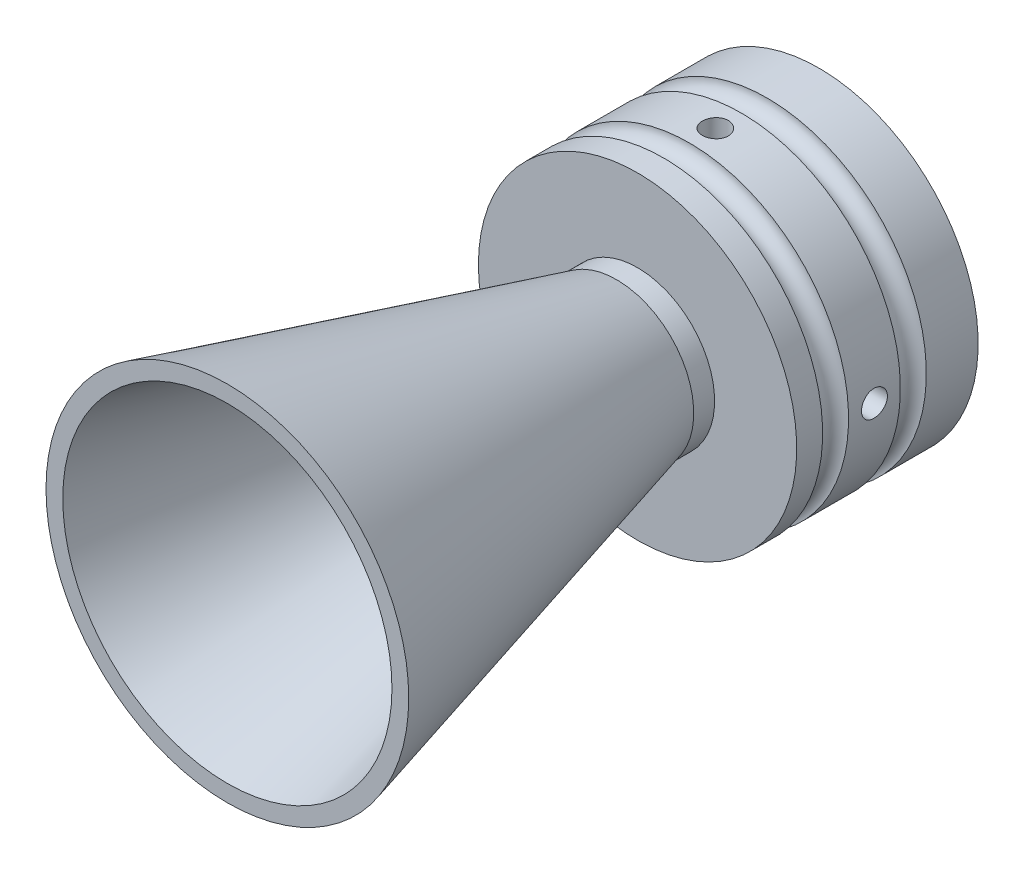
ISO-10303-21;
HEADER;
FILE_DESCRIPTION(('STEP AP214'),'2;1');
FILE_NAME('part.step','',(''),(''),'','','');
FILE_SCHEMA(('AUTOMOTIVE_DESIGN { 1 0 10303 214 1 1 1 1 }'));
ENDSEC;
DATA;
#1=APPLICATION_CONTEXT('core data for automotive mechanical design processes');
#2=APPLICATION_PROTOCOL_DEFINITION('international standard','automotive_design',2000,#1);
#3=PRODUCT_CONTEXT('',#1,'mechanical');
#4=PRODUCT('Part','Part','',(#3));
#5=PRODUCT_RELATED_PRODUCT_CATEGORY('part','',(#4));
#6=PRODUCT_DEFINITION_FORMATION('','',#4);
#7=PRODUCT_DEFINITION_CONTEXT('part definition',#1,'design');
#8=PRODUCT_DEFINITION('design','',#6,#7);
#9=PRODUCT_DEFINITION_SHAPE('','',#8);
#10=(LENGTH_UNIT() NAMED_UNIT(*) SI_UNIT(.MILLI.,.METRE.));
#11=(NAMED_UNIT(*) PLANE_ANGLE_UNIT() SI_UNIT($,.RADIAN.));
#12=(NAMED_UNIT(*) SI_UNIT($,.STERADIAN.) SOLID_ANGLE_UNIT());
#13=UNCERTAINTY_MEASURE_WITH_UNIT(LENGTH_MEASURE(1.E-05),#10,'distance_accuracy_value','');
#14=(GEOMETRIC_REPRESENTATION_CONTEXT(3) GLOBAL_UNCERTAINTY_ASSIGNED_CONTEXT((#13)) GLOBAL_UNIT_ASSIGNED_CONTEXT((#10,
#11,#12)) REPRESENTATION_CONTEXT('',''));
#15=CARTESIAN_POINT('',(0.,0.,0.));
#16=DIRECTION('',(0.,0.,1.));
#17=DIRECTION('',(1.,0.,0.));
#18=AXIS2_PLACEMENT_3D('',#15,#16,#17);
#19=CARTESIAN_POINT('',(0.,0.,-75.3084405577299));
#20=DIRECTION('',(0.,0.,-1.));
#21=DIRECTION('',(-1.,0.,0.));
#22=AXIS2_PLACEMENT_3D('',#19,#20,#21);
#23=CYLINDRICAL_SURFACE('',#22,24.5618);
#24=CARTESIAN_POINT('',(0.,0.,-27.1443538460579));
#25=DIRECTION('',(0.,0.,-1.));
#26=DIRECTION('',(-1.,0.,0.));
#27=AXIS2_PLACEMENT_3D('',#24,#25,#26);
#28=CIRCLE('',#27,24.5618);
#29=CARTESIAN_POINT('',(-24.5618,0.,-27.1443538460579));
#30=VERTEX_POINT('',#29);
#31=EDGE_CURVE('E118',#30,#30,#28,.T.);
#32=ORIENTED_EDGE('',*,*,#31,.F.);
#33=EDGE_LOOP('',(#32));
#34=FACE_BOUND('',#33,.T.);
#35=CARTESIAN_POINT('',(0.,0.,-19.1443538460579));
#36=DIRECTION('',(0.,0.,-1.));
#37=DIRECTION('',(-1.,0.,0.));
#38=AXIS2_PLACEMENT_3D('',#35,#36,#37);
#39=CIRCLE('',#38,24.5618);
#40=CARTESIAN_POINT('',(-24.5618,0.,-19.1443538460579));
#41=VERTEX_POINT('',#40);
#42=EDGE_CURVE('E85',#41,#41,#39,.T.);
#43=ORIENTED_EDGE('',*,*,#42,.T.);
#44=EDGE_LOOP('',(#43));
#45=FACE_BOUND('',#44,.T.);
#46=ADVANCED_FACE('F40',(#34,#45),#23,.T.);
#47=CARTESIAN_POINT('',(0.,0.,-27.1443538460579));
#48=DIRECTION('',(0.,0.,-1.));
#49=DIRECTION('',(-1.,0.,0.));
#50=AXIS2_PLACEMENT_3D('',#47,#48,#49);
#51=CONICAL_SURFACE('',#50,24.5618,0.5235987755983);
#52=CARTESIAN_POINT('',(0.,0.,0.));
#53=DIRECTION('',(0.,0.,-1.));
#54=DIRECTION('',(-1.,0.,0.));
#55=AXIS2_PLACEMENT_3D('',#52,#53,#54);
#56=CIRCLE('',#55,8.89000000000001);
#57=CARTESIAN_POINT('',(-8.89000000000001,0.,0.));
#58=VERTEX_POINT('',#57);
#59=EDGE_CURVE('E115',#58,#58,#56,.T.);
#60=ORIENTED_EDGE('',*,*,#59,.F.);
#61=EDGE_LOOP('',(#60));
#62=FACE_BOUND('',#61,.T.);
#63=ORIENTED_EDGE('',*,*,#31,.T.);
#64=EDGE_LOOP('',(#63));
#65=FACE_BOUND('',#64,.T.);
#66=ADVANCED_FACE('F158',(#62,#65),#51,.F.);
#67=CARTESIAN_POINT('',(0.,0.,-75.3084405577299));
#68=DIRECTION('',(0.,0.,-1.));
#69=DIRECTION('',(-1.,0.,0.));
#70=AXIS2_PLACEMENT_3D('',#67,#68,#69);
#71=CYLINDRICAL_SURFACE('',#70,8.89000000000001);
#72=CARTESIAN_POINT('',(0.,0.,2.54));
#73=DIRECTION('',(0.,0.,-1.));
#74=DIRECTION('',(-1.,0.,0.));
#75=AXIS2_PLACEMENT_3D('',#72,#73,#74);
#76=CIRCLE('',#75,8.89000000000001);
#77=CARTESIAN_POINT('',(-8.89000000000001,0.,2.54));
#78=VERTEX_POINT('',#77);
#79=EDGE_CURVE('E112',#78,#78,#76,.T.);
#80=ORIENTED_EDGE('',*,*,#79,.F.);
#81=EDGE_LOOP('',(#80));
#82=FACE_BOUND('',#81,.T.);
#83=ORIENTED_EDGE('',*,*,#59,.T.);
#84=EDGE_LOOP('',(#83));
#85=FACE_BOUND('',#84,.T.);
#86=ADVANCED_FACE('F163',(#82,#85),#71,.F.);
#87=CARTESIAN_POINT('',(0.,0.,2.54));
#88=DIRECTION('',(0.,0.,1.));
#89=DIRECTION('',(1.,0.,0.));
#90=AXIS2_PLACEMENT_3D('',#87,#88,#89);
#91=CONICAL_SURFACE('',#90,8.89000000000001,0.26179938779915);
#92=CARTESIAN_POINT('',(0.,0.,64.1561588329619));
#93=DIRECTION('',(0.,0.,-1.));
#94=DIRECTION('',(-1.,0.,0.));
#95=AXIS2_PLACEMENT_3D('',#92,#93,#94);
#96=CIRCLE('',#95,25.4);
#97=CARTESIAN_POINT('',(-25.4,0.,64.1561588329619));
#98=VERTEX_POINT('',#97);
#99=EDGE_CURVE('E109',#98,#98,#96,.T.);
#100=ORIENTED_EDGE('',*,*,#99,.F.);
#101=EDGE_LOOP('',(#100));
#102=FACE_BOUND('',#101,.T.);
#103=ORIENTED_EDGE('',*,*,#79,.T.);
#104=EDGE_LOOP('',(#103));
#105=FACE_BOUND('',#104,.T.);
#106=ADVANCED_FACE('F171',(#102,#105),#91,.F.);
#107=CARTESIAN_POINT('',(25.4,0.,64.156158832962));
#108=DIRECTION('',(0.,0.,-1.));
#109=DIRECTION('',(-1.,0.,0.));
#110=AXIS2_PLACEMENT_3D('',#107,#108,#109);
#111=PLANE('',#110);
#112=CARTESIAN_POINT('',(0.,0.,64.1561588329619));
#113=DIRECTION('',(0.,0.,-1.));
#114=DIRECTION('',(-1.,0.,0.));
#115=AXIS2_PLACEMENT_3D('',#112,#113,#114);
#116=CIRCLE('',#115,27.9881904510252);
#117=CARTESIAN_POINT('',(-27.9881904510252,0.,64.1561588329619));
#118=VERTEX_POINT('',#117);
#119=EDGE_CURVE('E106',#118,#118,#116,.T.);
#120=ORIENTED_EDGE('',*,*,#119,.F.);
#121=EDGE_LOOP('',(#120));
#122=FACE_BOUND('',#121,.T.);
#123=ORIENTED_EDGE('',*,*,#99,.T.);
#124=EDGE_LOOP('',(#123));
#125=FACE_BOUND('',#124,.T.);
#126=ADVANCED_FACE('F178',(#122,#125),#111,.F.);
#127=CARTESIAN_POINT('',(0.,0.,64.1561588329619));
#128=DIRECTION('',(0.,0.,1.));
#129=DIRECTION('',(1.,0.,0.));
#130=AXIS2_PLACEMENT_3D('',#127,#128,#129);
#131=CONICAL_SURFACE('',#130,27.9881904510252,0.261799387799151);
#132=CARTESIAN_POINT('',(0.,0.,4.07689415981595));
#133=DIRECTION('',(0.,0.,-1.));
#134=DIRECTION('',(-1.,0.,0.));
#135=AXIS2_PLACEMENT_3D('',#132,#133,#134);
#136=CIRCLE('',#135,11.89);
#137=CARTESIAN_POINT('',(-11.89,0.,4.07689415981595));
#138=VERTEX_POINT('',#137);
#139=EDGE_CURVE('E103',#138,#138,#136,.T.);
#140=ORIENTED_EDGE('',*,*,#139,.F.);
#141=EDGE_LOOP('',(#140));
#142=FACE_BOUND('',#141,.T.);
#143=ORIENTED_EDGE('',*,*,#119,.T.);
#144=EDGE_LOOP('',(#143));
#145=FACE_BOUND('',#144,.T.);
#146=ADVANCED_FACE('F182',(#142,#145),#131,.T.);
#147=CARTESIAN_POINT('',(0.,0.,-75.3084405577299));
#148=DIRECTION('',(0.,0.,-1.));
#149=DIRECTION('',(-1.,0.,0.));
#150=AXIS2_PLACEMENT_3D('',#147,#148,#149);
#151=CYLINDRICAL_SURFACE('',#150,11.89);
#152=CARTESIAN_POINT('',(0.,0.,0.855646153942138));
#153=DIRECTION('',(0.,0.,-1.));
#154=DIRECTION('',(-1.,0.,0.));
#155=AXIS2_PLACEMENT_3D('',#152,#153,#154);
#156=CIRCLE('',#155,11.89);
#157=CARTESIAN_POINT('',(-11.89,0.,0.855646153942138));
#158=VERTEX_POINT('',#157);
#159=EDGE_CURVE('E100',#158,#158,#156,.T.);
#160=ORIENTED_EDGE('',*,*,#159,.F.);
#161=EDGE_LOOP('',(#160));
#162=FACE_BOUND('',#161,.T.);
#163=ORIENTED_EDGE('',*,*,#139,.T.);
#164=EDGE_LOOP('',(#163));
#165=FACE_BOUND('',#164,.T.);
#166=ADVANCED_FACE('F186',(#162,#165),#151,.T.);
#167=CARTESIAN_POINT('',(11.89,0.,0.855646153942135));
#168=DIRECTION('',(0.,0.,-1.));
#169=DIRECTION('',(-1.,0.,0.));
#170=AXIS2_PLACEMENT_3D('',#167,#168,#169);
#171=PLANE('',#170);
#172=CARTESIAN_POINT('',(0.,0.,0.855646153942138));
#173=DIRECTION('',(0.,0.,-1.));
#174=DIRECTION('',(-1.,0.,0.));
#175=AXIS2_PLACEMENT_3D('',#172,#173,#174);
#176=CIRCLE('',#175,24.5618);
#177=CARTESIAN_POINT('',(-24.5618,0.,0.855646153942138));
#178=VERTEX_POINT('',#177);
#179=EDGE_CURVE('E97',#178,#178,#176,.T.);
#180=ORIENTED_EDGE('',*,*,#179,.F.);
#181=EDGE_LOOP('',(#180));
#182=FACE_BOUND('',#181,.T.);
#183=ORIENTED_EDGE('',*,*,#159,.T.);
#184=EDGE_LOOP('',(#183));
#185=FACE_BOUND('',#184,.T.);
#186=ADVANCED_FACE('F190',(#182,#185),#171,.F.);
#187=CARTESIAN_POINT('',(0.,0.,-75.3084405577299));
#188=DIRECTION('',(0.,0.,-1.));
#189=DIRECTION('',(-1.,0.,0.));
#190=AXIS2_PLACEMENT_3D('',#187,#188,#189);
#191=CYLINDRICAL_SURFACE('',#190,24.5618);
#192=CARTESIAN_POINT('',(0.,0.,-3.14435384605787));
#193=DIRECTION('',(0.,0.,-1.));
#194=DIRECTION('',(-1.,0.,0.));
#195=AXIS2_PLACEMENT_3D('',#192,#193,#194);
#196=CIRCLE('',#195,24.5618);
#197=CARTESIAN_POINT('',(-24.5618,0.,-3.14435384605787));
#198=VERTEX_POINT('',#197);
#199=EDGE_CURVE('E94',#198,#198,#196,.T.);
#200=ORIENTED_EDGE('',*,*,#199,.F.);
#201=EDGE_LOOP('',(#200));
#202=FACE_BOUND('',#201,.T.);
#203=ORIENTED_EDGE('',*,*,#179,.T.);
#204=EDGE_LOOP('',(#203));
#205=FACE_BOUND('',#204,.T.);
#206=ADVANCED_FACE('F194',(#202,#205),#191,.T.);
#207=CARTESIAN_POINT('',(0.,0.,-5.14435384605787));
#208=DIRECTION('',(0.,0.,-1.));
#209=DIRECTION('',(-1.,0.,0.));
#210=AXIS2_PLACEMENT_3D('',#207,#208,#209);
#211=TOROIDAL_SURFACE('',#210,24.5618,2.);
#212=CARTESIAN_POINT('',(0.,0.,-7.14435384605787));
#213=DIRECTION('',(0.,0.,-1.));
#214=DIRECTION('',(-1.,0.,0.));
#215=AXIS2_PLACEMENT_3D('',#212,#213,#214);
#216=CIRCLE('',#215,24.5618);
#217=CARTESIAN_POINT('',(-24.5618,0.,-7.14435384605787));
#218=VERTEX_POINT('',#217);
#219=EDGE_CURVE('E91',#218,#218,#216,.T.);
#220=ORIENTED_EDGE('',*,*,#219,.F.);
#221=EDGE_LOOP('',(#220));
#222=FACE_BOUND('',#221,.T.);
#223=ORIENTED_EDGE('',*,*,#199,.T.);
#224=EDGE_LOOP('',(#223));
#225=FACE_BOUND('',#224,.T.);
#226=ADVANCED_FACE('F153',(#222,#225),#211,.F.);
#227=CARTESIAN_POINT('',(0.,0.,-75.3084405577299));
#228=DIRECTION('',(0.,0.,-1.));
#229=DIRECTION('',(-1.,0.,0.));
#230=AXIS2_PLACEMENT_3D('',#227,#228,#229);
#231=CYLINDRICAL_SURFACE('',#230,24.5618);
#232=CARTESIAN_POINT('',(0.,24.5618,-9.14435384605787));
#233=CARTESIAN_POINT('',(-0.112141593484284,24.5617989315381,-9.14435874811144));
#234=CARTESIAN_POINT('',(-0.224359753682799,24.5610238041837,-9.15381737125759));
#235=CARTESIAN_POINT('',(-0.445691870877797,24.5580061929669,-9.19141078284147));
#236=CARTESIAN_POINT('',(-0.554802154040363,24.5557620420353,-9.21956678986824));
#237=CARTESIAN_POINT('',(-0.76668086212744,24.5500600119672,-9.29373593751335));
#238=CARTESIAN_POINT('',(-0.869452812845445,24.5466028148983,-9.33973904465828));
#239=CARTESIAN_POINT('',(-1.06579142249106,24.5388625155217,-9.44827875128519));
#240=CARTESIAN_POINT('',(-1.15936005884735,24.5345795912182,-9.51081178844397));
#241=CARTESIAN_POINT('',(-1.33488912846614,24.5256568334725,-9.65080123813603));
#242=CARTESIAN_POINT('',(-1.4168240164639,24.5210162481033,-9.72828963608943));
#243=CARTESIAN_POINT('',(-1.56654063553194,24.5119075106196,-9.89592272796304));
#244=CARTESIAN_POINT('',(-1.63432174808216,24.5074393660477,-9.98606797469985));
#245=CARTESIAN_POINT('',(-1.75389264893964,24.4991732510783,-10.1766097968936));
#246=CARTESIAN_POINT('',(-1.80566007898563,24.4953762208288,-10.2770204471328));
#247=CARTESIAN_POINT('',(-1.89159128999419,24.4888907359153,-10.4851446433521));
#248=CARTESIAN_POINT('',(-1.92575536924911,24.4862022624667,-10.5928580655504));
#249=CARTESIAN_POINT('',(-1.97543622928937,24.4822445277374,-10.8122749693194));
#250=CARTESIAN_POINT('',(-1.99099451343345,24.4809721081522,-10.9239689957066));
#251=CARTESIAN_POINT('',(-2.00315034735945,24.4799805359079,-11.1483898322658));
#252=CARTESIAN_POINT('',(-1.99974823837185,24.4802613552951,-11.2611166238147));
#253=CARTESIAN_POINT('',(-1.97411417310895,24.4823416649176,-11.4841188385109));
#254=CARTESIAN_POINT('',(-1.95192730226052,24.4841375188718,-11.5943994828793));
#255=CARTESIAN_POINT('',(-1.88942355030596,24.489039839819,-11.8096662806615));
#256=CARTESIAN_POINT('',(-1.84910649915756,24.4921463191043,-11.9146523844076));
#257=CARTESIAN_POINT('',(-1.75143628711684,24.4993240464494,-12.116493732019));
#258=CARTESIAN_POINT('',(-1.69406287524686,24.5033964401687,-12.2133391341247));
#259=CARTESIAN_POINT('',(-1.56392316815058,24.5120460643315,-12.3960423698499));
#260=CARTESIAN_POINT('',(-1.49115657548718,24.5166233045293,-12.4818999911048));
#261=CARTESIAN_POINT('',(-1.33204310256705,24.5257830444986,-12.6404526475324));
#262=CARTESIAN_POINT('',(-1.24565724111137,24.5303655206868,-12.7131085707402));
#263=CARTESIAN_POINT('',(-1.06189347076513,24.5390066648017,-12.8428930647051));
#264=CARTESIAN_POINT('',(-0.964515554959157,24.5430653323989,-12.9000216256934));
#265=CARTESIAN_POINT('',(-0.761506630046312,24.5502022750295,-12.9971272003369));
#266=CARTESIAN_POINT('',(-0.655874801100777,24.5532804525189,-13.0371025076398));
#267=CARTESIAN_POINT('',(-0.439368106974056,24.5581084499974,-13.0987395689671));
#268=CARTESIAN_POINT('',(-0.328493345726816,24.5598582963071,-13.1204016858648));
#269=CARTESIAN_POINT('',(-0.104987164495275,24.5618290904761,-13.1447484803297));
#270=CARTESIAN_POINT('',(0.00763833330109771,24.5620543911013,-13.1474871870383));
#271=CARTESIAN_POINT('',(0.231746894714884,24.5609623288912,-13.1340509187828));
#272=CARTESIAN_POINT('',(0.343229968490891,24.5596449797854,-13.1178761121477));
#273=CARTESIAN_POINT('',(0.561735222455953,24.5556185842572,-13.0671167370458));
#274=CARTESIAN_POINT('',(0.668763251956354,24.5529114291862,-13.0325571855992));
#275=CARTESIAN_POINT('',(0.875501407121716,24.5464095806382,-12.9460348763494));
#276=CARTESIAN_POINT('',(0.975211422133711,24.5426148707209,-12.8940718554608));
#277=CARTESIAN_POINT('',(1.16472918322411,24.5343525505745,-12.774081689002));
#278=CARTESIAN_POINT('',(1.25451418216037,24.5298834479219,-12.7060187199422));
#279=CARTESIAN_POINT('',(1.4214036910347,24.5207795496767,-12.5558125040719));
#280=CARTESIAN_POINT('',(1.49850799057751,24.5161447513364,-12.4736690236869));
#281=CARTESIAN_POINT('',(1.63803248389374,24.507218973617,-12.2973992226019));
#282=CARTESIAN_POINT('',(1.70041744147482,24.502928835165,-12.2032449625951));
#283=CARTESIAN_POINT('',(1.80849082929525,24.4951899013911,-12.005765504431));
#284=CARTESIAN_POINT('',(1.85417941976015,24.4917410979954,-11.902440394293));
#285=CARTESIAN_POINT('',(1.92750301656592,24.4860799528597,-11.6896774288129));
#286=CARTESIAN_POINT('',(1.9551596554701,24.4838661300012,-11.5802470696249));
#287=CARTESIAN_POINT('',(1.99170473323817,24.4809205894277,-11.3582771328733));
#288=CARTESIAN_POINT('',(2.00059351439776,24.480188844682,-11.2457376120537));
#289=CARTESIAN_POINT('',(1.9993466786577,24.480290681317,-11.0210941229522));
#290=CARTESIAN_POINT('',(1.98926642817877,24.4811197071557,-10.9089898411436));
#291=CARTESIAN_POINT('',(1.95048305264641,24.4842399975029,-10.6880719673451));
#292=CARTESIAN_POINT('',(1.92177989854078,24.4865312642925,-10.579258380489));
#293=CARTESIAN_POINT('',(1.84657937422165,24.4923166738984,-10.368006658593));
#294=CARTESIAN_POINT('',(1.80008293099049,24.4958107540505,-10.2655681917497));
#295=CARTESIAN_POINT('',(1.69062199128293,24.5036081825676,-10.0699423404221));
#296=CARTESIAN_POINT('',(1.62765777053335,24.5079115173826,-9.97675480108181));
#297=CARTESIAN_POINT('',(1.48684069912956,24.5168574897544,-9.80199285502212));
#298=CARTESIAN_POINT('',(1.40894691182899,24.5215010380279,-9.72045148042843));
#299=CARTESIAN_POINT('',(1.24055490572318,24.5305959311298,-9.57156801992899));
#300=CARTESIAN_POINT('',(1.15005363825368,24.5350472291275,-9.50422937837309));
#301=CARTESIAN_POINT('',(0.958848784812307,24.5432637395329,-9.38557692814964));
#302=CARTESIAN_POINT('',(0.858127172153494,24.5470277057108,-9.33429210946005));
#303=CARTESIAN_POINT('',(0.649541116056348,24.55343067707,-9.24942754205893));
#304=CARTESIAN_POINT('',(0.541685061367675,24.5560709772283,-9.2158274018796));
#305=CARTESIAN_POINT('',(0.360991871524487,24.5592498609918,-9.17586145108481));
#306=CARTESIAN_POINT('',(0.289317448558754,24.5602018203546,-9.16406175927214));
#307=CARTESIAN_POINT('',(0.145106036745532,24.5614772347798,-9.14830638051456));
#308=CARTESIAN_POINT('',(0.0725690500678837,24.5618006914229,-9.14435067384174));
#309=CARTESIAN_POINT('',(0.,24.5618,-9.14435384605787));
#310=B_SPLINE_CURVE_WITH_KNOTS('',3,(#232,#233,#234,#235,#236,#237,#238,#239,#240,#241,#242,
#243,#244,#245,#246,#247,#248,#249,#250,#251,#252,#253,#254,#255,#256,#257,#258,#259,#260,#261,
#262,#263,#264,#265,#266,#267,#268,#269,#270,#271,#272,#273,#274,#275,#276,#277,#278,#279,#280,
#281,#282,#283,#284,#285,#286,#287,#288,#289,#290,#291,#292,#293,#294,#295,#296,#297,#298,#299,
#300,#301,#302,#303,#304,#305,#306,#307,#308,#309),.UNSPECIFIED.,.T.,.F.,(4,2,2,2,2,2,2,2,2,2,2,
2,2,2,2,2,2,2,2,2,2,2,2,2,2,2,2,2,2,2,2,2,2,2,2,2,2,2,4),(0.,0.336159827874987,
0.672701797698236,1.0090548402966,1.34533545531821,1.68234341603319,2.01936610091733,
2.35685723401653,2.69434264807169,3.03107383142367,3.36779895463901,3.70371818528233,
4.03964056656492,4.37596339151666,4.71229271571157,5.04960277158238,5.38691303966608,
5.72425685455181,6.06159398486005,6.39796756819628,6.73433815785193,7.07025219804378,
7.40617131642046,7.74284502783746,8.07952432470397,8.41700159120252,8.75447561903851,
9.09154403758109,9.42860630848187,9.76468629459759,10.1007668050078,10.4368298089137,
10.7728871863381,11.1098795630184,11.4469535710586,11.7846328017556,12.1219218108085,
12.3394580520542,12.556993746188),.UNSPECIFIED.);
#311=CARTESIAN_POINT('',(0.,24.5618,-9.14435384605787));
#312=VERTEX_POINT('',#311);
#313=EDGE_CURVE('E11',#312,#312,#310,.T.);
#314=ORIENTED_EDGE('',*,*,#313,.T.);
#315=EDGE_LOOP('',(#314));
#316=FACE_BOUND('',#315,.T.);
#317=CARTESIAN_POINT('',(24.5618,0.,-13.1443538460579));
#318=CARTESIAN_POINT('',(24.5617989315381,-0.112141593484284,-13.1443489440043));
#319=CARTESIAN_POINT('',(24.5610238041837,-0.224359753682799,-13.1348903208581));
#320=CARTESIAN_POINT('',(24.5580061929669,-0.445691870877796,-13.0972969092742));
#321=CARTESIAN_POINT('',(24.5557620420353,-0.554802154040362,-13.0691409022475));
#322=CARTESIAN_POINT('',(24.5500600119672,-0.766680862127437,-12.9949717546024));
#323=CARTESIAN_POINT('',(24.5466028148983,-0.869452812845441,-12.9489686474574));
#324=CARTESIAN_POINT('',(24.5388625155217,-1.06579142249106,-12.8404289408305));
#325=CARTESIAN_POINT('',(24.5345795912182,-1.15936005884734,-12.7778959036717));
#326=CARTESIAN_POINT('',(24.5256568334725,-1.33488912846613,-12.6379064539797));
#327=CARTESIAN_POINT('',(24.5210162481033,-1.41682401646388,-12.5604180560263));
#328=CARTESIAN_POINT('',(24.5119075106196,-1.56654063553193,-12.3927849641526));
#329=CARTESIAN_POINT('',(24.5074393660477,-1.63432174808214,-12.3026397174158));
#330=CARTESIAN_POINT('',(24.4991732510783,-1.75389264893962,-12.112097895222));
#331=CARTESIAN_POINT('',(24.4953762208288,-1.8056600789856,-12.0116872449829));
#332=CARTESIAN_POINT('',(24.4888907359153,-1.89159128999416,-11.8035630487636));
#333=CARTESIAN_POINT('',(24.4862022624667,-1.92575536924908,-11.6958496265653));
#334=CARTESIAN_POINT('',(24.4822445277374,-1.97543622928934,-11.4764327227962));
#335=CARTESIAN_POINT('',(24.4809721081522,-1.99099451343341,-11.3647386964091));
#336=CARTESIAN_POINT('',(24.4799805359079,-2.00315034735941,-11.1403178598498));
#337=CARTESIAN_POINT('',(24.4802613552951,-1.99974823837181,-11.0275910683009));
#338=CARTESIAN_POINT('',(24.4823416649176,-1.9741141731089,-10.8045888536048));
#339=CARTESIAN_POINT('',(24.4841375188718,-1.95192730226047,-10.6943082092364));
#340=CARTESIAN_POINT('',(24.489039839819,-1.88942355030591,-10.4790414114542));
#341=CARTESIAN_POINT('',(24.4921463191043,-1.8491064991575,-10.3740553077081));
#342=CARTESIAN_POINT('',(24.4993240464494,-1.75143628711678,-10.1722139600967));
#343=CARTESIAN_POINT('',(24.5033964401687,-1.69406287524679,-10.075368557991));
#344=CARTESIAN_POINT('',(24.5120460643315,-1.56392316815051,-9.89266532226582));
#345=CARTESIAN_POINT('',(24.5166233045293,-1.4911565754871,-9.80680770101094));
#346=CARTESIAN_POINT('',(24.5257830444986,-1.33204310256698,-9.64825504458329));
#347=CARTESIAN_POINT('',(24.5303655206868,-1.24565724111129,-9.57559912137547));
#348=CARTESIAN_POINT('',(24.5390066648017,-1.06189347076505,-9.44581462741058));
#349=CARTESIAN_POINT('',(24.5430653323989,-0.964515554959078,-9.38868606642231));
#350=CARTESIAN_POINT('',(24.5502022750295,-0.761506630046231,-9.29158049177879));
#351=CARTESIAN_POINT('',(24.5532804525189,-0.655874801100695,-9.25160518447587));
#352=CARTESIAN_POINT('',(24.5581084499974,-0.439368106973973,-9.18996812314862));
#353=CARTESIAN_POINT('',(24.5598582963071,-0.328493345726732,-9.16830600625095));
#354=CARTESIAN_POINT('',(24.5618290904761,-0.10498716449519,-9.14395921178603));
#355=CARTESIAN_POINT('',(24.5620543911013,0.00763833330118329,-9.14122050507741));
#356=CARTESIAN_POINT('',(24.5609623288912,0.23174689471497,-9.15465677333292));
#357=CARTESIAN_POINT('',(24.5596449797854,0.343229968490976,-9.17083157996801));
#358=CARTESIAN_POINT('',(24.5556185842572,0.561735222456037,-9.22159095506994));
#359=CARTESIAN_POINT('',(24.5529114291862,0.668763251956437,-9.25615050651649));
#360=CARTESIAN_POINT('',(24.5464095806382,0.875501407121798,-9.34267281576635));
#361=CARTESIAN_POINT('',(24.5426148707209,0.975211422133792,-9.39463583665495));
#362=CARTESIAN_POINT('',(24.5343525505745,1.16472918322419,-9.5146260031137));
#363=CARTESIAN_POINT('',(24.5298834479219,1.25451418216045,-9.58268897217352));
#364=CARTESIAN_POINT('',(24.5207795496767,1.42140369103477,-9.73289518804386));
#365=CARTESIAN_POINT('',(24.5161447513364,1.49850799057758,-9.81503866842882));
#366=CARTESIAN_POINT('',(24.5072189736169,1.63803248389381,-9.99130846951383));
#367=CARTESIAN_POINT('',(24.502928835165,1.70041744147488,-10.0854627295207));
#368=CARTESIAN_POINT('',(24.4951899013911,1.80849082929531,-10.2829421876848));
#369=CARTESIAN_POINT('',(24.4917410979953,1.85417941976021,-10.3862672978228));
#370=CARTESIAN_POINT('',(24.4860799528597,1.92750301656598,-10.5990302633029));
#371=CARTESIAN_POINT('',(24.4838661300012,1.95515965547015,-10.7084606224909));
#372=CARTESIAN_POINT('',(24.4809205894277,1.99170473323822,-10.9304305592425));
#373=CARTESIAN_POINT('',(24.480188844682,2.00059351439781,-11.0429700800621));
#374=CARTESIAN_POINT('',(24.480290681317,1.99934667865774,-11.2676135691636));
#375=CARTESIAN_POINT('',(24.4811197071557,1.98926642817881,-11.3797178509722));
#376=CARTESIAN_POINT('',(24.4842399975029,1.95048305264644,-11.6006357247707));
#377=CARTESIAN_POINT('',(24.4865312642924,1.92177989854081,-11.7094493116268));
#378=CARTESIAN_POINT('',(24.4923166738984,1.84657937422168,-11.9207010335228));
#379=CARTESIAN_POINT('',(24.4958107540505,1.80008293099051,-12.0231395003661));
#380=CARTESIAN_POINT('',(24.5036081825676,1.69062199128295,-12.2187653516936));
#381=CARTESIAN_POINT('',(24.5079115173826,1.62765777053336,-12.311952891034));
#382=CARTESIAN_POINT('',(24.5168574897544,1.48684069912957,-12.4867148370936));
#383=CARTESIAN_POINT('',(24.5215010380278,1.408946911829,-12.5682562116873));
#384=CARTESIAN_POINT('',(24.5305959311298,1.24055490572319,-12.7171396721868));
#385=CARTESIAN_POINT('',(24.5350472291275,1.15005363825369,-12.7844783137427));
#386=CARTESIAN_POINT('',(24.5432637395329,0.958848784812312,-12.9031307639661));
#387=CARTESIAN_POINT('',(24.5470277057108,0.858127172153498,-12.9544155826557));
#388=CARTESIAN_POINT('',(24.55343067707,0.64954111605635,-13.0392801500568));
#389=CARTESIAN_POINT('',(24.5560709772283,0.541685061367676,-13.0728802902361));
#390=CARTESIAN_POINT('',(24.5592498609918,0.360991871524486,-13.1128462410309));
#391=CARTESIAN_POINT('',(24.5602018203546,0.289317448558752,-13.1246459328436));
#392=CARTESIAN_POINT('',(24.5614772347798,0.145106036745531,-13.1404013116012));
#393=CARTESIAN_POINT('',(24.5618006914229,0.0725690500678831,-13.144357018274));
#394=CARTESIAN_POINT('',(24.5618,0.,-13.1443538460579));
#395=B_SPLINE_CURVE_WITH_KNOTS('',3,(#317,#318,#319,#320,#321,#322,#323,#324,#325,#326,#327,
#328,#329,#330,#331,#332,#333,#334,#335,#336,#337,#338,#339,#340,#341,#342,#343,#344,#345,#346,
#347,#348,#349,#350,#351,#352,#353,#354,#355,#356,#357,#358,#359,#360,#361,#362,#363,#364,#365,
#366,#367,#368,#369,#370,#371,#372,#373,#374,#375,#376,#377,#378,#379,#380,#381,#382,#383,#384,
#385,#386,#387,#388,#389,#390,#391,#392,#393,#394),.UNSPECIFIED.,.T.,.F.,(4,2,2,2,2,2,2,2,2,2,2,
2,2,2,2,2,2,2,2,2,2,2,2,2,2,2,2,2,2,2,2,2,2,2,2,2,2,2,4),(0.,0.336159827874987,
0.672701797698236,1.0090548402966,1.34533545531821,1.68234341603319,2.01936610091733,
2.35685723401653,2.69434264807169,3.03107383142367,3.36779895463901,3.70371818528233,
4.03964056656492,4.37596339151666,4.71229271571157,5.04960277158238,5.38691303966608,
5.72425685455181,6.06159398486005,6.39796756819628,6.73433815785193,7.07025219804378,
7.40617131642046,7.74284502783746,8.07952432470397,8.41700159120252,8.75447561903851,
9.0915440375811,9.42860630848187,9.76468629459759,10.1007668050078,10.4368298089137,
10.7728871863381,11.1098795630184,11.4469535710586,11.7846328017556,12.1219218108085,
12.3394580520542,12.556993746188),.UNSPECIFIED.);
#396=CARTESIAN_POINT('',(24.5618,0.,-13.1443538460579));
#397=VERTEX_POINT('',#396);
#398=EDGE_CURVE('E52',#397,#397,#395,.T.);
#399=ORIENTED_EDGE('',*,*,#398,.T.);
#400=EDGE_LOOP('',(#399));
#401=FACE_BOUND('',#400,.T.);
#402=CARTESIAN_POINT('',(0.,-24.5618,-13.1443538460579));
#403=CARTESIAN_POINT('',(-0.112141593484284,-24.5617989315381,-13.1443489440043));
#404=CARTESIAN_POINT('',(-0.224359753682799,-24.5610238041837,-13.1348903208581));
#405=CARTESIAN_POINT('',(-0.445691870877797,-24.5580061929669,-13.0972969092742));
#406=CARTESIAN_POINT('',(-0.554802154040363,-24.5557620420353,-13.0691409022475));
#407=CARTESIAN_POINT('',(-0.76668086212744,-24.5500600119672,-12.9949717546024));
#408=CARTESIAN_POINT('',(-0.869452812845446,-24.5466028148983,-12.9489686474574));
#409=CARTESIAN_POINT('',(-1.06579142249106,-24.5388625155217,-12.8404289408305));
#410=CARTESIAN_POINT('',(-1.15936005884735,-24.5345795912182,-12.7778959036718));
#411=CARTESIAN_POINT('',(-1.33488912846614,-24.5256568334725,-12.6379064539797));
#412=CARTESIAN_POINT('',(-1.4168240164639,-24.5210162481033,-12.5604180560263));
#413=CARTESIAN_POINT('',(-1.56654063553194,-24.5119075106196,-12.3927849641527));
#414=CARTESIAN_POINT('',(-1.63432174808216,-24.5074393660477,-12.3026397174159));
#415=CARTESIAN_POINT('',(-1.75389264893964,-24.4991732510783,-12.1120978952221));
#416=CARTESIAN_POINT('',(-1.80566007898563,-24.4953762208288,-12.011687244983));
#417=CARTESIAN_POINT('',(-1.89159128999419,-24.4888907359153,-11.8035630487636));
#418=CARTESIAN_POINT('',(-1.92575536924911,-24.4862022624667,-11.6958496265654));
#419=CARTESIAN_POINT('',(-1.97543622928937,-24.4822445277374,-11.4764327227963));
#420=CARTESIAN_POINT('',(-1.99099451343345,-24.4809721081522,-11.3647386964091));
#421=CARTESIAN_POINT('',(-2.00315034735945,-24.4799805359079,-11.1403178598499));
#422=CARTESIAN_POINT('',(-1.99974823837185,-24.4802613552951,-11.027591068301));
#423=CARTESIAN_POINT('',(-1.97411417310895,-24.4823416649176,-10.8045888536049));
#424=CARTESIAN_POINT('',(-1.95192730226052,-24.4841375188718,-10.6943082092364));
#425=CARTESIAN_POINT('',(-1.88942355030596,-24.489039839819,-10.4790414114542));
#426=CARTESIAN_POINT('',(-1.84910649915756,-24.4921463191043,-10.3740553077081));
#427=CARTESIAN_POINT('',(-1.75143628711684,-24.4993240464494,-10.1722139600967));
#428=CARTESIAN_POINT('',(-1.69406287524686,-24.5033964401687,-10.075368557991));
#429=CARTESIAN_POINT('',(-1.56392316815058,-24.5120460643315,-9.89266532226585));
#430=CARTESIAN_POINT('',(-1.49115657548718,-24.5166233045293,-9.80680770101097));
#431=CARTESIAN_POINT('',(-1.33204310256705,-24.5257830444986,-9.64825504458332));
#432=CARTESIAN_POINT('',(-1.24565724111137,-24.5303655206868,-9.57559912137549));
#433=CARTESIAN_POINT('',(-1.06189347076513,-24.5390066648017,-9.4458146274106));
#434=CARTESIAN_POINT('',(-0.964515554959157,-24.5430653323989,-9.38868606642233));
#435=CARTESIAN_POINT('',(-0.761506630046312,-24.5502022750295,-9.2915804917788));
#436=CARTESIAN_POINT('',(-0.655874801100777,-24.5532804525189,-9.25160518447589));
#437=CARTESIAN_POINT('',(-0.439368106974056,-24.5581084499974,-9.18996812314863));
#438=CARTESIAN_POINT('',(-0.328493345726816,-24.5598582963071,-9.16830600625096));
#439=CARTESIAN_POINT('',(-0.104987164495275,-24.5618290904761,-9.14395921178603));
#440=CARTESIAN_POINT('',(0.00763833330109771,-24.5620543911013,-9.14122050507741));
#441=CARTESIAN_POINT('',(0.231746894714884,-24.5609623288912,-9.15465677333292));
#442=CARTESIAN_POINT('',(0.343229968490891,-24.5596449797854,-9.170831579968));
#443=CARTESIAN_POINT('',(0.561735222455953,-24.5556185842572,-9.22159095506993));
#444=CARTESIAN_POINT('',(0.668763251956354,-24.5529114291862,-9.25615050651648));
#445=CARTESIAN_POINT('',(0.875501407121716,-24.5464095806382,-9.34267281576633));
#446=CARTESIAN_POINT('',(0.975211422133712,-24.5426148707209,-9.39463583665493));
#447=CARTESIAN_POINT('',(1.16472918322411,-24.5343525505745,-9.51462600311368));
#448=CARTESIAN_POINT('',(1.25451418216037,-24.5298834479219,-9.5826889721735));
#449=CARTESIAN_POINT('',(1.4214036910347,-24.5207795496767,-9.73289518804383));
#450=CARTESIAN_POINT('',(1.49850799057751,-24.5161447513364,-9.81503866842879));
#451=CARTESIAN_POINT('',(1.63803248389374,-24.507218973617,-9.99130846951379));
#452=CARTESIAN_POINT('',(1.70041744147482,-24.502928835165,-10.0854627295207));
#453=CARTESIAN_POINT('',(1.80849082929525,-24.4951899013911,-10.2829421876848));
#454=CARTESIAN_POINT('',(1.85417941976015,-24.4917410979954,-10.3862672978227));
#455=CARTESIAN_POINT('',(1.92750301656592,-24.4860799528597,-10.5990302633029));
#456=CARTESIAN_POINT('',(1.9551596554701,-24.4838661300012,-10.7084606224908));
#457=CARTESIAN_POINT('',(1.99170473323817,-24.4809205894277,-10.9304305592425));
#458=CARTESIAN_POINT('',(2.00059351439776,-24.480188844682,-11.042970080062));
#459=CARTESIAN_POINT('',(1.9993466786577,-24.480290681317,-11.2676135691635));
#460=CARTESIAN_POINT('',(1.98926642817877,-24.4811197071557,-11.3797178509721));
#461=CARTESIAN_POINT('',(1.95048305264641,-24.4842399975029,-11.6006357247707));
#462=CARTESIAN_POINT('',(1.92177989854078,-24.4865312642925,-11.7094493116268));
#463=CARTESIAN_POINT('',(1.84657937422165,-24.4923166738984,-11.9207010335228));
#464=CARTESIAN_POINT('',(1.80008293099049,-24.4958107540505,-12.023139500366));
#465=CARTESIAN_POINT('',(1.69062199128293,-24.5036081825676,-12.2187653516936));
#466=CARTESIAN_POINT('',(1.62765777053335,-24.5079115173826,-12.3119528910339));
#467=CARTESIAN_POINT('',(1.48684069912956,-24.5168574897544,-12.4867148370936));
#468=CARTESIAN_POINT('',(1.40894691182899,-24.5215010380279,-12.5682562116873));
#469=CARTESIAN_POINT('',(1.24055490572318,-24.5305959311298,-12.7171396721867));
#470=CARTESIAN_POINT('',(1.15005363825368,-24.5350472291275,-12.7844783137426));
#471=CARTESIAN_POINT('',(0.958848784812307,-24.5432637395329,-12.9031307639661));
#472=CARTESIAN_POINT('',(0.858127172153494,-24.5470277057108,-12.9544155826557));
#473=CARTESIAN_POINT('',(0.649541116056348,-24.55343067707,-13.0392801500568));
#474=CARTESIAN_POINT('',(0.541685061367675,-24.5560709772283,-13.0728802902361));
#475=CARTESIAN_POINT('',(0.360991871524487,-24.5592498609918,-13.1128462410309));
#476=CARTESIAN_POINT('',(0.289317448558754,-24.5602018203546,-13.1246459328436));
#477=CARTESIAN_POINT('',(0.145106036745532,-24.5614772347798,-13.1404013116012));
#478=CARTESIAN_POINT('',(0.0725690500678837,-24.5618006914229,-13.144357018274));
#479=CARTESIAN_POINT('',(0.,-24.5618,-13.1443538460579));
#480=B_SPLINE_CURVE_WITH_KNOTS('',3,(#402,#403,#404,#405,#406,#407,#408,#409,#410,#411,#412,
#413,#414,#415,#416,#417,#418,#419,#420,#421,#422,#423,#424,#425,#426,#427,#428,#429,#430,#431,
#432,#433,#434,#435,#436,#437,#438,#439,#440,#441,#442,#443,#444,#445,#446,#447,#448,#449,#450,
#451,#452,#453,#454,#455,#456,#457,#458,#459,#460,#461,#462,#463,#464,#465,#466,#467,#468,#469,
#470,#471,#472,#473,#474,#475,#476,#477,#478,#479),.UNSPECIFIED.,.T.,.F.,(4,2,2,2,2,2,2,2,2,2,2,
2,2,2,2,2,2,2,2,2,2,2,2,2,2,2,2,2,2,2,2,2,2,2,2,2,2,2,4),(0.,0.336159827874987,
0.672701797698236,1.0090548402966,1.34533545531821,1.68234341603319,2.01936610091733,
2.35685723401653,2.69434264807169,3.03107383142367,3.36779895463901,3.70371818528233,
4.03964056656492,4.37596339151666,4.71229271571157,5.04960277158238,5.38691303966608,
5.72425685455181,6.06159398486005,6.39796756819628,6.73433815785193,7.07025219804378,
7.40617131642046,7.74284502783746,8.07952432470397,8.41700159120252,8.75447561903851,
9.09154403758109,9.42860630848187,9.76468629459759,10.1007668050078,10.4368298089137,
10.7728871863381,11.1098795630184,11.4469535710586,11.7846328017556,12.1219218108085,
12.3394580520542,12.556993746188),.UNSPECIFIED.);
#481=CARTESIAN_POINT('',(0.,-24.5618,-13.1443538460579));
#482=VERTEX_POINT('',#481);
#483=EDGE_CURVE('E128',#482,#482,#480,.T.);
#484=ORIENTED_EDGE('',*,*,#483,.T.);
#485=EDGE_LOOP('',(#484));
#486=FACE_BOUND('',#485,.T.);
#487=CARTESIAN_POINT('',(-24.5618,0.,-9.14435384605787));
#488=CARTESIAN_POINT('',(-24.5617989315381,-0.112141593484285,-9.14435874811144));
#489=CARTESIAN_POINT('',(-24.5610238041837,-0.224359753682799,-9.15381737125759));
#490=CARTESIAN_POINT('',(-24.5580061929669,-0.445691870877797,-9.19141078284148));
#491=CARTESIAN_POINT('',(-24.5557620420353,-0.554802154040362,-9.21956678986825));
#492=CARTESIAN_POINT('',(-24.5500600119672,-0.766680862127438,-9.29373593751336));
#493=CARTESIAN_POINT('',(-24.5466028148983,-0.869452812845442,-9.3397390446583));
#494=CARTESIAN_POINT('',(-24.5388625155217,-1.06579142249106,-9.44827875128521));
#495=CARTESIAN_POINT('',(-24.5345795912182,-1.15936005884734,-9.51081178844399));
#496=CARTESIAN_POINT('',(-24.5256568334725,-1.33488912846613,-9.65080123813605));
#497=CARTESIAN_POINT('',(-24.5210162481033,-1.41682401646389,-9.72828963608945));
#498=CARTESIAN_POINT('',(-24.5119075106196,-1.56654063553193,-9.89592272796307));
#499=CARTESIAN_POINT('',(-24.5074393660477,-1.63432174808215,-9.98606797469988));
#500=CARTESIAN_POINT('',(-24.4991732510783,-1.75389264893962,-10.1766097968937));
#501=CARTESIAN_POINT('',(-24.4953762208288,-1.80566007898561,-10.2770204471328));
#502=CARTESIAN_POINT('',(-24.4888907359153,-1.89159128999416,-10.4851446433521));
#503=CARTESIAN_POINT('',(-24.4862022624667,-1.92575536924909,-10.5928580655504));
#504=CARTESIAN_POINT('',(-24.4822445277374,-1.97543622928934,-10.8122749693195));
#505=CARTESIAN_POINT('',(-24.4809721081522,-1.99099451343342,-10.9239689957066));
#506=CARTESIAN_POINT('',(-24.4799805359079,-2.00315034735942,-11.1483898322659));
#507=CARTESIAN_POINT('',(-24.4802613552951,-1.99974823837182,-11.2611166238148));
#508=CARTESIAN_POINT('',(-24.4823416649176,-1.97411417310891,-11.4841188385109));
#509=CARTESIAN_POINT('',(-24.4841375188718,-1.95192730226048,-11.5943994828794));
#510=CARTESIAN_POINT('',(-24.489039839819,-1.88942355030592,-11.8096662806615));
#511=CARTESIAN_POINT('',(-24.4921463191043,-1.84910649915752,-11.9146523844076));
#512=CARTESIAN_POINT('',(-24.4993240464494,-1.75143628711679,-12.116493732019));
#513=CARTESIAN_POINT('',(-24.5033964401687,-1.69406287524681,-12.2133391341247));
#514=CARTESIAN_POINT('',(-24.5120460643315,-1.56392316815052,-12.3960423698499));
#515=CARTESIAN_POINT('',(-24.5166233045293,-1.49115657548712,-12.4818999911048));
#516=CARTESIAN_POINT('',(-24.5257830444986,-1.33204310256699,-12.6404526475324));
#517=CARTESIAN_POINT('',(-24.5303655206868,-1.2456572411113,-12.7131085707403));
#518=CARTESIAN_POINT('',(-24.5390066648017,-1.06189347076507,-12.8428930647051));
#519=CARTESIAN_POINT('',(-24.5430653323989,-0.964515554959092,-12.9000216256934));
#520=CARTESIAN_POINT('',(-24.5502022750295,-0.761506630046246,-12.9971272003369));
#521=CARTESIAN_POINT('',(-24.5532804525189,-0.655874801100711,-13.0371025076398));
#522=CARTESIAN_POINT('',(-24.5581084499974,-0.439368106973989,-13.0987395689671));
#523=CARTESIAN_POINT('',(-24.5598582963071,-0.328493345726748,-13.1204016858648));
#524=CARTESIAN_POINT('',(-24.5618290904761,-0.104987164495207,-13.1447484803297));
#525=CARTESIAN_POINT('',(-24.5620543911013,0.00763833330116603,-13.1474871870383));
#526=CARTESIAN_POINT('',(-24.5609623288912,0.231746894714953,-13.1340509187828));
#527=CARTESIAN_POINT('',(-24.5596449797854,0.343229968490959,-13.1178761121477));
#528=CARTESIAN_POINT('',(-24.5556185842572,0.561735222456021,-13.0671167370458));
#529=CARTESIAN_POINT('',(-24.5529114291862,0.668763251956422,-13.0325571855992));
#530=CARTESIAN_POINT('',(-24.5464095806382,0.875501407121782,-12.9460348763494));
#531=CARTESIAN_POINT('',(-24.5426148707209,0.975211422133776,-12.8940718554608));
#532=CARTESIAN_POINT('',(-24.5343525505745,1.16472918322417,-12.774081689002));
#533=CARTESIAN_POINT('',(-24.5298834479219,1.25451418216043,-12.7060187199422));
#534=CARTESIAN_POINT('',(-24.5207795496767,1.42140369103476,-12.5558125040719));
#535=CARTESIAN_POINT('',(-24.5161447513364,1.49850799057757,-12.4736690236869));
#536=CARTESIAN_POINT('',(-24.5072189736169,1.63803248389379,-12.2973992226019));
#537=CARTESIAN_POINT('',(-24.502928835165,1.70041744147487,-12.203244962595));
#538=CARTESIAN_POINT('',(-24.4951899013911,1.8084908292953,-12.0057655044309));
#539=CARTESIAN_POINT('',(-24.4917410979953,1.85417941976019,-11.902440394293));
#540=CARTESIAN_POINT('',(-24.4860799528597,1.92750301656597,-11.6896774288128));
#541=CARTESIAN_POINT('',(-24.4838661300012,1.95515965547014,-11.5802470696249));
#542=CARTESIAN_POINT('',(-24.4809205894277,1.99170473323821,-11.3582771328732));
#543=CARTESIAN_POINT('',(-24.480188844682,2.0005935143978,-11.2457376120537));
#544=CARTESIAN_POINT('',(-24.480290681317,1.99934667865774,-11.0210941229522));
#545=CARTESIAN_POINT('',(-24.4811197071557,1.9892664281788,-10.9089898411436));
#546=CARTESIAN_POINT('',(-24.4842399975029,1.95048305264644,-10.688071967345));
#547=CARTESIAN_POINT('',(-24.4865312642925,1.92177989854081,-10.5792583804889));
#548=CARTESIAN_POINT('',(-24.4923166738984,1.84657937422167,-10.3680066585929));
#549=CARTESIAN_POINT('',(-24.4958107540505,1.8000829309905,-10.2655681917497));
#550=CARTESIAN_POINT('',(-24.5036081825676,1.69062199128295,-10.0699423404221));
#551=CARTESIAN_POINT('',(-24.5079115173826,1.62765777053336,-9.97675480108177));
#552=CARTESIAN_POINT('',(-24.5168574897544,1.48684069912957,-9.80199285502209));
#553=CARTESIAN_POINT('',(-24.5215010380279,1.408946911829,-9.72045148042841));
#554=CARTESIAN_POINT('',(-24.5305959311298,1.24055490572319,-9.57156801992897));
#555=CARTESIAN_POINT('',(-24.5350472291275,1.15005363825369,-9.50422937837307));
#556=CARTESIAN_POINT('',(-24.5432637395329,0.958848784812311,-9.38557692814962));
#557=CARTESIAN_POINT('',(-24.5470277057108,0.858127172153497,-9.33429210946003));
#558=CARTESIAN_POINT('',(-24.55343067707,0.649541116056349,-9.24942754205892));
#559=CARTESIAN_POINT('',(-24.5560709772283,0.541685061367676,-9.21582740187959));
#560=CARTESIAN_POINT('',(-24.5592498609918,0.360991871524486,-9.1758614510848));
#561=CARTESIAN_POINT('',(-24.5602018203546,0.289317448558752,-9.16406175927214));
#562=CARTESIAN_POINT('',(-24.5614772347798,0.145106036745531,-9.14830638051455));
#563=CARTESIAN_POINT('',(-24.5618006914229,0.0725690500678829,-9.14435067384174));
#564=CARTESIAN_POINT('',(-24.5618,0.,-9.14435384605787));
#565=B_SPLINE_CURVE_WITH_KNOTS('',3,(#487,#488,#489,#490,#491,#492,#493,#494,#495,#496,#497,
#498,#499,#500,#501,#502,#503,#504,#505,#506,#507,#508,#509,#510,#511,#512,#513,#514,#515,#516,
#517,#518,#519,#520,#521,#522,#523,#524,#525,#526,#527,#528,#529,#530,#531,#532,#533,#534,#535,
#536,#537,#538,#539,#540,#541,#542,#543,#544,#545,#546,#547,#548,#549,#550,#551,#552,#553,#554,
#555,#556,#557,#558,#559,#560,#561,#562,#563,#564),.UNSPECIFIED.,.T.,.F.,(4,2,2,2,2,2,2,2,2,2,2,
2,2,2,2,2,2,2,2,2,2,2,2,2,2,2,2,2,2,2,2,2,2,2,2,2,2,2,4),(0.,0.336159827874987,
0.672701797698236,1.0090548402966,1.34533545531821,1.68234341603319,2.01936610091733,
2.35685723401653,2.6943426480717,3.03107383142367,3.36779895463901,3.70371818528233,
4.03964056656492,4.37596339151666,4.71229271571157,5.04960277158238,5.38691303966608,
5.72425685455181,6.06159398486005,6.39796756819628,6.73433815785193,7.07025219804378,
7.40617131642046,7.74284502783746,8.07952432470397,8.41700159120252,8.75447561903851,
9.09154403758109,9.42860630848187,9.76468629459759,10.1007668050078,10.4368298089137,
10.7728871863381,11.1098795630184,11.4469535710586,11.7846328017556,12.1219218108085,
12.3394580520542,12.556993746188),.UNSPECIFIED.);
#566=CARTESIAN_POINT('',(-24.5618,0.,-9.14435384605787));
#567=VERTEX_POINT('',#566);
#568=EDGE_CURVE('E121',#567,#567,#565,.T.);
#569=ORIENTED_EDGE('',*,*,#568,.T.);
#570=EDGE_LOOP('',(#569));
#571=FACE_BOUND('',#570,.T.);
#572=CARTESIAN_POINT('',(0.,0.,-15.1443538460579));
#573=DIRECTION('',(0.,0.,-1.));
#574=DIRECTION('',(-1.,0.,0.));
#575=AXIS2_PLACEMENT_3D('',#572,#573,#574);
#576=CIRCLE('',#575,24.5618);
#577=CARTESIAN_POINT('',(-24.5618,0.,-15.1443538460579));
#578=VERTEX_POINT('',#577);
#579=EDGE_CURVE('E88',#578,#578,#576,.T.);
#580=ORIENTED_EDGE('',*,*,#579,.F.);
#581=EDGE_LOOP('',(#580));
#582=FACE_BOUND('',#581,.T.);
#583=ORIENTED_EDGE('',*,*,#219,.T.);
#584=EDGE_LOOP('',(#583));
#585=FACE_BOUND('',#584,.T.);
#586=ADVANCED_FACE('F133',(#316,#401,#486,#571,#582,#585),#231,.T.);
#587=CARTESIAN_POINT('',(0.,0.,-17.1443538460579));
#588=DIRECTION('',(0.,0.,-1.));
#589=DIRECTION('',(-1.,0.,0.));
#590=AXIS2_PLACEMENT_3D('',#587,#588,#589);
#591=TOROIDAL_SURFACE('',#590,24.5618,2.);
#592=ORIENTED_EDGE('',*,*,#42,.F.);
#593=EDGE_LOOP('',(#592));
#594=FACE_BOUND('',#593,.T.);
#595=ORIENTED_EDGE('',*,*,#579,.T.);
#596=EDGE_LOOP('',(#595));
#597=FACE_BOUND('',#596,.T.);
#598=ADVANCED_FACE('F143',(#594,#597),#591,.F.);
#599=CARTESIAN_POINT('',(-24.5618,0.,-11.1443538460579));
#600=DIRECTION('',(-1.,0.,0.));
#601=DIRECTION('',(0.,0.,1.));
#602=AXIS2_PLACEMENT_3D('',#599,#600,#601);
#603=CYLINDRICAL_SURFACE('',#602,1.99999999999999);
#604=CARTESIAN_POINT('',(-19.5618,0.,-11.1443538460579));
#605=DIRECTION('',(-1.,0.,0.));
#606=DIRECTION('',(0.,0.,1.));
#607=AXIS2_PLACEMENT_3D('',#604,#605,#606);
#608=CIRCLE('',#607,2.);
#609=CARTESIAN_POINT('',(-19.5618,0.,-9.14435384605786));
#610=VERTEX_POINT('',#609);
#611=EDGE_CURVE('E82',#610,#610,#608,.T.);
#612=ORIENTED_EDGE('',*,*,#611,.F.);
#613=EDGE_LOOP('',(#612));
#614=FACE_BOUND('',#613,.T.);
#615=ORIENTED_EDGE('',*,*,#568,.F.);
#616=EDGE_LOOP('',(#615));
#617=FACE_BOUND('',#616,.T.);
#618=ADVANCED_FACE('F137',(#614,#617),#603,.F.);
#619=CARTESIAN_POINT('',(-19.5618,0.,-11.1443538460579));
#620=DIRECTION('',(-1.,0.,0.));
#621=DIRECTION('',(0.,0.,1.));
#622=AXIS2_PLACEMENT_3D('',#619,#620,#621);
#623=CONICAL_SURFACE('',#622,2.,1.02974425867665);
#624=CARTESIAN_POINT('',(-18.3600787619449,0.,-11.1443538460579));
#625=VERTEX_POINT('',#624);
#626=VERTEX_LOOP('',#625);
#627=FACE_BOUND('',#626,.T.);
#628=ORIENTED_EDGE('',*,*,#611,.T.);
#629=EDGE_LOOP('',(#628));
#630=FACE_BOUND('',#629,.T.);
#631=ADVANCED_FACE('F142',(#627,#630),#623,.F.);
#632=CARTESIAN_POINT('',(0.,-24.5618,-11.1443538460579));
#633=DIRECTION('',(0.,-1.,0.));
#634=DIRECTION('',(0.,0.,-1.));
#635=AXIS2_PLACEMENT_3D('',#632,#633,#634);
#636=CYLINDRICAL_SURFACE('',#635,1.99999999999999);
#637=CARTESIAN_POINT('',(0.,-19.5618,-11.1443538460579));
#638=DIRECTION('',(0.,-1.,0.));
#639=DIRECTION('',(0.,0.,-1.));
#640=AXIS2_PLACEMENT_3D('',#637,#638,#639);
#641=CIRCLE('',#640,2.);
#642=CARTESIAN_POINT('',(0.,-19.5618,-13.1443538460579));
#643=VERTEX_POINT('',#642);
#644=EDGE_CURVE('E77',#643,#643,#641,.T.);
#645=ORIENTED_EDGE('',*,*,#644,.F.);
#646=EDGE_LOOP('',(#645));
#647=FACE_BOUND('',#646,.T.);
#648=ORIENTED_EDGE('',*,*,#483,.F.);
#649=EDGE_LOOP('',(#648));
#650=FACE_BOUND('',#649,.T.);
#651=ADVANCED_FACE('F147',(#647,#650),#636,.F.);
#652=CARTESIAN_POINT('',(0.,-19.5618,-11.1443538460579));
#653=DIRECTION('',(0.,-1.,0.));
#654=DIRECTION('',(0.,0.,-1.));
#655=AXIS2_PLACEMENT_3D('',#652,#653,#654);
#656=CONICAL_SURFACE('',#655,2.,1.02974425867665);
#657=CARTESIAN_POINT('',(0.,-18.3600787619449,-11.1443538460579));
#658=VERTEX_POINT('',#657);
#659=VERTEX_LOOP('',#658);
#660=FACE_BOUND('',#659,.T.);
#661=ORIENTED_EDGE('',*,*,#644,.T.);
#662=EDGE_LOOP('',(#661));
#663=FACE_BOUND('',#662,.T.);
#664=ADVANCED_FACE('F145',(#660,#663),#656,.F.);
#665=CARTESIAN_POINT('',(24.5618,0.,-11.1443538460579));
#666=DIRECTION('',(1.,0.,0.));
#667=DIRECTION('',(0.,0.,-1.));
#668=AXIS2_PLACEMENT_3D('',#665,#666,#667);
#669=CYLINDRICAL_SURFACE('',#668,1.99999999999999);
#670=CARTESIAN_POINT('',(19.5618,0.,-11.1443538460579));
#671=DIRECTION('',(1.,0.,0.));
#672=DIRECTION('',(0.,0.,-1.));
#673=AXIS2_PLACEMENT_3D('',#670,#671,#672);
#674=CIRCLE('',#673,2.);
#675=CARTESIAN_POINT('',(19.5618,0.,-13.1443538460579));
#676=VERTEX_POINT('',#675);
#677=EDGE_CURVE('E74',#676,#676,#674,.T.);
#678=ORIENTED_EDGE('',*,*,#677,.F.);
#679=EDGE_LOOP('',(#678));
#680=FACE_BOUND('',#679,.T.);
#681=ORIENTED_EDGE('',*,*,#398,.F.);
#682=EDGE_LOOP('',(#681));
#683=FACE_BOUND('',#682,.T.);
#684=ADVANCED_FACE('F260',(#680,#683),#669,.F.);
#685=CARTESIAN_POINT('',(19.5618,0.,-11.1443538460579));
#686=DIRECTION('',(1.,0.,0.));
#687=DIRECTION('',(0.,0.,-1.));
#688=AXIS2_PLACEMENT_3D('',#685,#686,#687);
#689=CONICAL_SURFACE('',#688,2.,1.02974425867665);
#690=CARTESIAN_POINT('',(18.3600787619449,0.,-11.1443538460579));
#691=VERTEX_POINT('',#690);
#692=VERTEX_LOOP('',#691);
#693=FACE_BOUND('',#692,.T.);
#694=ORIENTED_EDGE('',*,*,#677,.T.);
#695=EDGE_LOOP('',(#694));
#696=FACE_BOUND('',#695,.T.);
#697=ADVANCED_FACE('F269',(#693,#696),#689,.F.);
#698=CARTESIAN_POINT('',(0.,24.5618,-11.1443538460579));
#699=DIRECTION('',(0.,1.,0.));
#700=DIRECTION('',(0.,0.,1.));
#701=AXIS2_PLACEMENT_3D('',#698,#699,#700);
#702=CYLINDRICAL_SURFACE('',#701,1.99999999999999);
#703=CARTESIAN_POINT('',(0.,19.5618,-11.1443538460579));
#704=DIRECTION('',(0.,1.,0.));
#705=DIRECTION('',(0.,0.,1.));
#706=AXIS2_PLACEMENT_3D('',#703,#704,#705);
#707=CIRCLE('',#706,2.);
#708=CARTESIAN_POINT('',(0.,19.5618,-9.14435384605786));
#709=VERTEX_POINT('',#708);
#710=EDGE_CURVE('E72',#709,#709,#707,.T.);
#711=ORIENTED_EDGE('',*,*,#710,.F.);
#712=EDGE_LOOP('',(#711));
#713=FACE_BOUND('',#712,.T.);
#714=ORIENTED_EDGE('',*,*,#313,.F.);
#715=EDGE_LOOP('',(#714));
#716=FACE_BOUND('',#715,.T.);
#717=ADVANCED_FACE('F68',(#713,#716),#702,.F.);
#718=CARTESIAN_POINT('',(0.,19.5618,-11.1443538460579));
#719=DIRECTION('',(0.,1.,0.));
#720=DIRECTION('',(0.,0.,1.));
#721=AXIS2_PLACEMENT_3D('',#718,#719,#720);
#722=CONICAL_SURFACE('',#721,2.,1.02974425867665);
#723=CARTESIAN_POINT('',(0.,18.3600787619449,-11.1443538460579));
#724=VERTEX_POINT('',#723);
#725=VERTEX_LOOP('',#724);
#726=FACE_BOUND('',#725,.T.);
#727=ORIENTED_EDGE('',*,*,#710,.T.);
#728=EDGE_LOOP('',(#727));
#729=FACE_BOUND('',#728,.T.);
#730=ADVANCED_FACE('F65',(#726,#729),#722,.F.);
#731=CLOSED_SHELL('',(#46,#66,#86,#106,#126,#146,#166,#186,#206,#226,#586,#598,#618,#631,#651,
#664,#684,#697,#717,#730));
#732=MANIFOLD_SOLID_BREP('B2',#731);
#733=ADVANCED_BREP_SHAPE_REPRESENTATION('',(#18,#732),#14);
#734=SHAPE_DEFINITION_REPRESENTATION(#9,#733);
ENDSEC;
END-ISO-10303-21;
